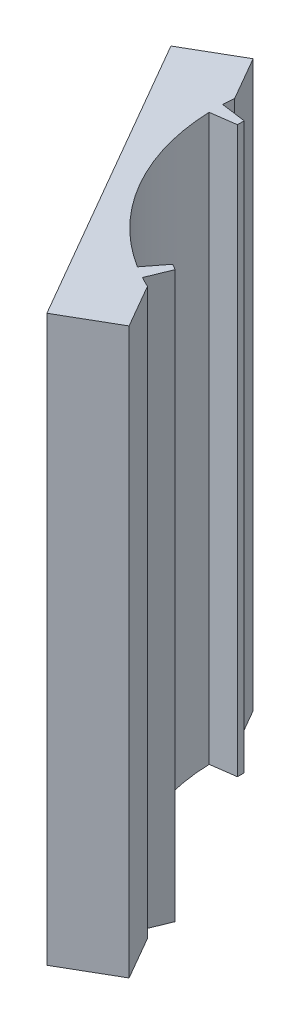
ISO-10303-21;
HEADER;
FILE_DESCRIPTION(('STEP AP214'),'2;1');
FILE_NAME('part.step','',(''),(''),'','','');
FILE_SCHEMA(('AUTOMOTIVE_DESIGN { 1 0 10303 214 1 1 1 1 }'));
ENDSEC;
DATA;
#1=APPLICATION_CONTEXT('core data for automotive mechanical design processes');
#2=APPLICATION_PROTOCOL_DEFINITION('international standard','automotive_design',2000,#1);
#3=PRODUCT_CONTEXT('',#1,'mechanical');
#4=PRODUCT('Part','Part','',(#3));
#5=PRODUCT_RELATED_PRODUCT_CATEGORY('part','',(#4));
#6=PRODUCT_DEFINITION_FORMATION('','',#4);
#7=PRODUCT_DEFINITION_CONTEXT('part definition',#1,'design');
#8=PRODUCT_DEFINITION('design','',#6,#7);
#9=PRODUCT_DEFINITION_SHAPE('','',#8);
#10=(LENGTH_UNIT() NAMED_UNIT(*) SI_UNIT(.MILLI.,.METRE.));
#11=(NAMED_UNIT(*) PLANE_ANGLE_UNIT() SI_UNIT($,.RADIAN.));
#12=(NAMED_UNIT(*) SI_UNIT($,.STERADIAN.) SOLID_ANGLE_UNIT());
#13=UNCERTAINTY_MEASURE_WITH_UNIT(LENGTH_MEASURE(1.E-05),#10,'distance_accuracy_value','');
#14=(GEOMETRIC_REPRESENTATION_CONTEXT(3) GLOBAL_UNCERTAINTY_ASSIGNED_CONTEXT((#13)) GLOBAL_UNIT_ASSIGNED_CONTEXT((#10,
#11,#12)) REPRESENTATION_CONTEXT('',''));
#15=CARTESIAN_POINT('',(0.,0.,0.));
#16=DIRECTION('',(0.,0.,1.));
#17=DIRECTION('',(1.,0.,0.));
#18=AXIS2_PLACEMENT_3D('',#15,#16,#17);
#19=CARTESIAN_POINT('',(7.50000000000003,50.,12.9903810567665));
#20=DIRECTION('',(0.500000000000002,0.,0.866025403784437));
#21=DIRECTION('',(0.866025403784437,0.,-0.500000000000002));
#22=AXIS2_PLACEMENT_3D('',#19,#20,#21);
#23=PLANE('',#22);
#24=DIRECTION('',(-0.866025403784437,0.,0.500000000000002));
#25=VECTOR('',#24,1.);
#26=CARTESIAN_POINT('',(7.50000000000003,0.,12.9903810567665));
#27=LINE('',#26,#25);
#28=CARTESIAN_POINT('',(-5.55299139381477,0.,20.5265291517154));
#29=VERTEX_POINT('',#28);
#30=CARTESIAN_POINT('',(-10.1669182372025,0.,23.1903810567666));
#31=VERTEX_POINT('',#30);
#32=EDGE_CURVE('E166',#29,#31,#27,.T.);
#33=ORIENTED_EDGE('',*,*,#32,.F.);
#34=DIRECTION('',(0.,-1.,0.));
#35=VECTOR('',#34,1.);
#36=CARTESIAN_POINT('',(-5.55299139381477,50.,20.5265291517154));
#37=LINE('',#36,#35);
#38=CARTESIAN_POINT('',(-5.55299139381477,50.,20.5265291517154));
#39=VERTEX_POINT('',#38);
#40=EDGE_CURVE('E11',#39,#29,#37,.T.);
#41=ORIENTED_EDGE('',*,*,#40,.F.);
#42=DIRECTION('',(-0.866025403784437,0.,0.500000000000002));
#43=VECTOR('',#42,1.);
#44=CARTESIAN_POINT('',(7.50000000000003,50.,12.9903810567665));
#45=LINE('',#44,#43);
#46=CARTESIAN_POINT('',(-10.1669182372025,50.,23.1903810567666));
#47=VERTEX_POINT('',#46);
#48=EDGE_CURVE('E198',#39,#47,#45,.T.);
#49=ORIENTED_EDGE('',*,*,#48,.T.);
#50=DIRECTION('',(0.,-1.,0.));
#51=VECTOR('',#50,1.);
#52=CARTESIAN_POINT('',(-10.1669182372025,50.,23.1903810567666));
#53=LINE('',#52,#51);
#54=EDGE_CURVE('E51',#47,#31,#53,.T.);
#55=ORIENTED_EDGE('',*,*,#54,.T.);
#56=EDGE_LOOP('',(#33,#41,#49,#55));
#57=FACE_BOUND('',#56,.T.);
#58=ADVANCED_FACE('F35',(#57),#23,.T.);
#59=CARTESIAN_POINT('',(-13.0529913938148,50.,7.53614809494887));
#60=DIRECTION('',(0.866025403784438,0.,-0.500000000000001));
#61=DIRECTION('',(-0.500000000000001,0.,-0.866025403784438));
#62=AXIS2_PLACEMENT_3D('',#59,#60,#61);
#63=PLANE('',#62);
#64=DIRECTION('',(0.500000000000001,0.,0.866025403784438));
#65=VECTOR('',#64,1.);
#66=CARTESIAN_POINT('',(-13.0529913938148,0.,7.53614809494887));
#67=LINE('',#66,#65);
#68=CARTESIAN_POINT('',(-7.77601575515593,0.,16.6761380114092));
#69=VERTEX_POINT('',#68);
#70=EDGE_CURVE('E168',#69,#29,#67,.T.);
#71=ORIENTED_EDGE('',*,*,#70,.F.);
#72=DIRECTION('',(0.,-1.,0.));
#73=VECTOR('',#72,1.);
#74=CARTESIAN_POINT('',(-7.77601575515593,50.,16.6761380114092));
#75=LINE('',#74,#73);
#76=CARTESIAN_POINT('',(-7.77601575515593,50.,16.6761380114092));
#77=VERTEX_POINT('',#76);
#78=EDGE_CURVE('E43',#77,#69,#75,.T.);
#79=ORIENTED_EDGE('',*,*,#78,.F.);
#80=DIRECTION('',(0.500000000000001,0.,0.866025403784438));
#81=VECTOR('',#80,1.);
#82=CARTESIAN_POINT('',(-13.0529913938148,50.,7.53614809494887));
#83=LINE('',#82,#81);
#84=EDGE_CURVE('E157',#77,#39,#83,.T.);
#85=ORIENTED_EDGE('',*,*,#84,.T.);
#86=ORIENTED_EDGE('',*,*,#40,.T.);
#87=EDGE_LOOP('',(#71,#79,#85,#86));
#88=FACE_BOUND('',#87,.T.);
#89=ADVANCED_FACE('F228',(#88),#63,.T.);
#90=CARTESIAN_POINT('',(0.,50.,0.));
#91=DIRECTION('',(0.,-1.,0.));
#92=DIRECTION('',(0.,0.,-1.));
#93=AXIS2_PLACEMENT_3D('',#90,#91,#92);
#94=CYLINDRICAL_SURFACE('',#93,18.4);
#95=CARTESIAN_POINT('',(0.,0.,0.));
#96=DIRECTION('',(0.,1.,0.));
#97=DIRECTION('',(0.,0.,1.));
#98=AXIS2_PLACEMENT_3D('',#95,#96,#97);
#99=CIRCLE('',#98,18.4);
#100=CARTESIAN_POINT('',(-8.67549215242567,0.,16.2263931886664));
#101=VERTEX_POINT('',#100);
#102=EDGE_CURVE('E171',#101,#69,#99,.T.);
#103=ORIENTED_EDGE('',*,*,#102,.F.);
#104=DIRECTION('',(0.,-1.,0.));
#105=VECTOR('',#104,1.);
#106=CARTESIAN_POINT('',(-8.67549215242567,50.,16.2263931886664));
#107=LINE('',#106,#105);
#108=CARTESIAN_POINT('',(-8.67549215242567,50.,16.2263931886664));
#109=VERTEX_POINT('',#108);
#110=EDGE_CURVE('E217',#109,#101,#107,.T.);
#111=ORIENTED_EDGE('',*,*,#110,.F.);
#112=CARTESIAN_POINT('',(0.,50.,0.));
#113=DIRECTION('',(0.,1.,0.));
#114=DIRECTION('',(0.,0.,1.));
#115=AXIS2_PLACEMENT_3D('',#112,#113,#114);
#116=CIRCLE('',#115,18.4);
#117=EDGE_CURVE('E224',#109,#77,#116,.T.);
#118=ORIENTED_EDGE('',*,*,#117,.T.);
#119=ORIENTED_EDGE('',*,*,#78,.T.);
#120=EDGE_LOOP('',(#103,#111,#118,#119));
#121=FACE_BOUND('',#120,.T.);
#122=ADVANCED_FACE('F222',(#121),#94,.F.);
#123=CARTESIAN_POINT('',(-1.74759815570033,50.,-0.714664627382081));
#124=DIRECTION('',(0.925595557587385,0.,0.378514020578496));
#125=DIRECTION('',(0.378514020578496,0.,-0.925595557587385));
#126=AXIS2_PLACEMENT_3D('',#123,#124,#125);
#127=PLANE('',#126);
#128=DIRECTION('',(-0.378514020578496,0.,0.925595557587385));
#129=VECTOR('',#128,1.);
#130=CARTESIAN_POINT('',(-1.74759815570033,0.,-0.714664627382081));
#131=LINE('',#130,#129);
#132=CARTESIAN_POINT('',(-7.83431886252672,0.,14.1694383125916));
#133=VERTEX_POINT('',#132);
#134=EDGE_CURVE('E174',#133,#101,#131,.T.);
#135=ORIENTED_EDGE('',*,*,#134,.F.);
#136=DIRECTION('',(0.,-1.,0.));
#137=VECTOR('',#136,1.);
#138=CARTESIAN_POINT('',(-7.83431886252672,50.,14.1694383125916));
#139=LINE('',#138,#137);
#140=CARTESIAN_POINT('',(-7.83431886252672,50.,14.1694383125916));
#141=VERTEX_POINT('',#140);
#142=EDGE_CURVE('E215',#141,#133,#139,.T.);
#143=ORIENTED_EDGE('',*,*,#142,.F.);
#144=DIRECTION('',(-0.378514020578496,0.,0.925595557587385));
#145=VECTOR('',#144,1.);
#146=CARTESIAN_POINT('',(-1.74759815570033,50.,-0.714664627382081));
#147=LINE('',#146,#145);
#148=EDGE_CURVE('E239',#141,#109,#147,.T.);
#149=ORIENTED_EDGE('',*,*,#148,.T.);
#150=ORIENTED_EDGE('',*,*,#110,.T.);
#151=EDGE_LOOP('',(#135,#143,#149,#150));
#152=FACE_BOUND('',#151,.T.);
#153=ADVANCED_FACE('F235',(#152),#127,.T.);
#154=CARTESIAN_POINT('',(-8.09412648366208,50.,14.0194383125916));
#155=DIRECTION('',(-0.499999999999999,0.,0.866025403784439));
#156=DIRECTION('',(0.866025403784439,0.,0.499999999999999));
#157=AXIS2_PLACEMENT_3D('',#154,#155,#156);
#158=PLANE('',#157);
#159=DIRECTION('',(-0.866025403784439,0.,-0.499999999999999));
#160=VECTOR('',#159,1.);
#161=CARTESIAN_POINT('',(-8.09412648366208,0.,14.0194383125916));
#162=LINE('',#161,#160);
#163=CARTESIAN_POINT('',(-8.35393410479738,0.,13.8694383125916));
#164=VERTEX_POINT('',#163);
#165=EDGE_CURVE('E179',#133,#164,#162,.T.);
#166=ORIENTED_EDGE('',*,*,#165,.T.);
#167=DIRECTION('',(0.,-1.,0.));
#168=VECTOR('',#167,1.);
#169=CARTESIAN_POINT('',(-8.35393410479738,50.,13.8694383125916));
#170=LINE('',#169,#168);
#171=CARTESIAN_POINT('',(-8.35393410479738,50.,13.8694383125916));
#172=VERTEX_POINT('',#171);
#173=EDGE_CURVE('E212',#172,#164,#170,.T.);
#174=ORIENTED_EDGE('',*,*,#173,.F.);
#175=DIRECTION('',(-0.866025403784439,0.,-0.499999999999999));
#176=VECTOR('',#175,1.);
#177=CARTESIAN_POINT('',(-8.09412648366208,50.,14.0194383125916));
#178=LINE('',#177,#176);
#179=EDGE_CURVE('E242',#141,#172,#178,.T.);
#180=ORIENTED_EDGE('',*,*,#179,.F.);
#181=ORIENTED_EDGE('',*,*,#142,.T.);
#182=EDGE_LOOP('',(#166,#174,#180,#181));
#183=FACE_BOUND('',#182,.T.);
#184=ADVANCED_FACE('F307',(#183),#158,.F.);
#185=CARTESIAN_POINT('',(1.49271680034924,50.,1.15613208475232));
#186=DIRECTION('',(0.790600536303257,0.,0.612332256211448));
#187=DIRECTION('',(0.612332256211448,0.,-0.790600536303257));
#188=AXIS2_PLACEMENT_3D('',#185,#186,#187);
#189=PLANE('',#188);
#190=DIRECTION('',(-0.612332256211448,0.,0.790600536303257));
#191=VECTOR('',#190,1.);
#192=CARTESIAN_POINT('',(1.49271680034924,0.,1.15613208475232));
#193=LINE('',#192,#191);
#194=CARTESIAN_POINT('',(-9.71472263696699,0.,15.6263931886664));
#195=VERTEX_POINT('',#194);
#196=EDGE_CURVE('E181',#164,#195,#193,.T.);
#197=ORIENTED_EDGE('',*,*,#196,.T.);
#198=DIRECTION('',(0.,-1.,0.));
#199=VECTOR('',#198,1.);
#200=CARTESIAN_POINT('',(-9.71472263696699,50.,15.6263931886664));
#201=LINE('',#200,#199);
#202=CARTESIAN_POINT('',(-9.71472263696699,50.,15.6263931886664));
#203=VERTEX_POINT('',#202);
#204=EDGE_CURVE('E210',#203,#195,#201,.T.);
#205=ORIENTED_EDGE('',*,*,#204,.F.);
#206=DIRECTION('',(-0.612332256211448,0.,0.790600536303257));
#207=VECTOR('',#206,1.);
#208=CARTESIAN_POINT('',(1.49271680034924,50.,1.15613208475232));
#209=LINE('',#208,#207);
#210=EDGE_CURVE('E246',#172,#203,#209,.T.);
#211=ORIENTED_EDGE('',*,*,#210,.F.);
#212=ORIENTED_EDGE('',*,*,#173,.T.);
#213=EDGE_LOOP('',(#197,#205,#211,#212));
#214=FACE_BOUND('',#213,.T.);
#215=ADVANCED_FACE('F300',(#214),#189,.F.);
#216=CARTESIAN_POINT('',(-18.3902147893928,0.,0.6));
#217=VERTEX_POINT('',#216);
#218=EDGE_CURVE('E176',#217,#195,#99,.T.);
#219=ORIENTED_EDGE('',*,*,#218,.F.);
#220=DIRECTION('',(0.,-1.,0.));
#221=VECTOR('',#220,1.);
#222=CARTESIAN_POINT('',(-18.3902147893928,50.,0.6));
#223=LINE('',#222,#221);
#224=CARTESIAN_POINT('',(-18.3902147893928,50.,0.6));
#225=VERTEX_POINT('',#224);
#226=EDGE_CURVE('E208',#225,#217,#223,.T.);
#227=ORIENTED_EDGE('',*,*,#226,.F.);
#228=EDGE_CURVE('E241',#225,#203,#116,.T.);
#229=ORIENTED_EDGE('',*,*,#228,.T.);
#230=ORIENTED_EDGE('',*,*,#204,.T.);
#231=EDGE_LOOP('',(#219,#227,#229,#230));
#232=FACE_BOUND('',#231,.T.);
#233=ADVANCED_FACE('F288',(#232),#94,.F.);
#234=CARTESIAN_POINT('',(-0.254881355351149,50.,-1.8707967121344));
#235=DIRECTION('',(0.134995021284128,0.,0.990846276789946));
#236=DIRECTION('',(0.990846276789946,0.,-0.134995021284128));
#237=AXIS2_PLACEMENT_3D('',#234,#235,#236);
#238=PLANE('',#237);
#239=DIRECTION('',(-0.990846276789946,0.,0.134995021284128));
#240=VECTOR('',#239,1.);
#241=CARTESIAN_POINT('',(-0.254881355351149,0.,-1.8707967121344));
#242=LINE('',#241,#240);
#243=CARTESIAN_POINT('',(-16.1882529673242,0.,0.3));
#244=VERTEX_POINT('',#243);
#245=EDGE_CURVE('E184',#244,#217,#242,.T.);
#246=ORIENTED_EDGE('',*,*,#245,.F.);
#247=DIRECTION('',(0.,-1.,0.));
#248=VECTOR('',#247,1.);
#249=CARTESIAN_POINT('',(-16.1882529673242,50.,0.3));
#250=LINE('',#249,#248);
#251=CARTESIAN_POINT('',(-16.1882529673242,50.,0.3));
#252=VERTEX_POINT('',#251);
#253=EDGE_CURVE('E206',#252,#244,#250,.T.);
#254=ORIENTED_EDGE('',*,*,#253,.F.);
#255=DIRECTION('',(-0.990846276789946,0.,0.134995021284128));
#256=VECTOR('',#255,1.);
#257=CARTESIAN_POINT('',(-0.254881355351149,50.,-1.8707967121344));
#258=LINE('',#257,#256);
#259=EDGE_CURVE('E245',#252,#225,#258,.T.);
#260=ORIENTED_EDGE('',*,*,#259,.T.);
#261=ORIENTED_EDGE('',*,*,#226,.T.);
#262=EDGE_LOOP('',(#246,#254,#260,#261));
#263=FACE_BOUND('',#262,.T.);
#264=ADVANCED_FACE('F299',(#263),#238,.T.);
#265=CARTESIAN_POINT('',(-16.1882529673242,50.,0.));
#266=DIRECTION('',(1.,0.,0.));
#267=DIRECTION('',(0.,0.,-1.));
#268=AXIS2_PLACEMENT_3D('',#265,#266,#267);
#269=PLANE('',#268);
#270=DIRECTION('',(0.,0.,1.));
#271=VECTOR('',#270,1.);
#272=CARTESIAN_POINT('',(-16.1882529673242,0.,0.));
#273=LINE('',#272,#271);
#274=CARTESIAN_POINT('',(-16.1882529673242,0.,-0.3));
#275=VERTEX_POINT('',#274);
#276=EDGE_CURVE('E187',#275,#244,#273,.T.);
#277=ORIENTED_EDGE('',*,*,#276,.F.);
#278=DIRECTION('',(0.,-1.,0.));
#279=VECTOR('',#278,1.);
#280=CARTESIAN_POINT('',(-16.1882529673242,50.,-0.3));
#281=LINE('',#280,#279);
#282=CARTESIAN_POINT('',(-16.1882529673242,50.,-0.3));
#283=VERTEX_POINT('',#282);
#284=EDGE_CURVE('E204',#283,#275,#281,.T.);
#285=ORIENTED_EDGE('',*,*,#284,.F.);
#286=DIRECTION('',(0.,0.,1.));
#287=VECTOR('',#286,1.);
#288=CARTESIAN_POINT('',(-16.1882529673242,50.,0.));
#289=LINE('',#288,#287);
#290=EDGE_CURVE('E250',#283,#252,#289,.T.);
#291=ORIENTED_EDGE('',*,*,#290,.T.);
#292=ORIENTED_EDGE('',*,*,#253,.T.);
#293=EDGE_LOOP('',(#277,#285,#291,#292));
#294=FACE_BOUND('',#293,.T.);
#295=ADVANCED_FACE('F296',(#294),#269,.T.);
#296=CARTESIAN_POINT('',(-0.254881355351148,50.,1.8707967121344));
#297=DIRECTION('',(-0.134995021284128,0.,0.990846276789946));
#298=DIRECTION('',(0.990846276789946,0.,0.134995021284128));
#299=AXIS2_PLACEMENT_3D('',#296,#297,#298);
#300=PLANE('',#299);
#301=DIRECTION('',(-0.990846276789946,0.,-0.134995021284128));
#302=VECTOR('',#301,1.);
#303=CARTESIAN_POINT('',(-0.254881355351148,0.,1.8707967121344));
#304=LINE('',#303,#302);
#305=CARTESIAN_POINT('',(-18.3902147893928,0.,-0.6));
#306=VERTEX_POINT('',#305);
#307=EDGE_CURVE('E190',#275,#306,#304,.T.);
#308=ORIENTED_EDGE('',*,*,#307,.T.);
#309=DIRECTION('',(0.,-1.,0.));
#310=VECTOR('',#309,1.);
#311=CARTESIAN_POINT('',(-18.3902147893928,50.,-0.6));
#312=LINE('',#311,#310);
#313=CARTESIAN_POINT('',(-18.3902147893928,50.,-0.6));
#314=VERTEX_POINT('',#313);
#315=EDGE_CURVE('E202',#314,#306,#312,.T.);
#316=ORIENTED_EDGE('',*,*,#315,.F.);
#317=DIRECTION('',(-0.990846276789946,0.,-0.134995021284128));
#318=VECTOR('',#317,1.);
#319=CARTESIAN_POINT('',(-0.254881355351148,50.,1.8707967121344));
#320=LINE('',#319,#318);
#321=EDGE_CURVE('E163',#283,#314,#320,.T.);
#322=ORIENTED_EDGE('',*,*,#321,.F.);
#323=ORIENTED_EDGE('',*,*,#284,.T.);
#324=EDGE_LOOP('',(#308,#316,#322,#323));
#325=FACE_BOUND('',#324,.T.);
#326=ADVANCED_FACE('F263',(#325),#300,.F.);
#327=CARTESIAN_POINT('',(-18.3299670324736,0.,-1.60384182151147));
#328=VERTEX_POINT('',#327);
#329=EDGE_CURVE('E175',#328,#306,#99,.T.);
#330=ORIENTED_EDGE('',*,*,#329,.F.);
#331=DIRECTION('',(0.,-1.,0.));
#332=VECTOR('',#331,1.);
#333=CARTESIAN_POINT('',(-18.3299670324736,50.,-1.60384182151147));
#334=LINE('',#333,#332);
#335=CARTESIAN_POINT('',(-18.3299670324736,50.,-1.60384182151147));
#336=VERTEX_POINT('',#335);
#337=EDGE_CURVE('E146',#336,#328,#334,.T.);
#338=ORIENTED_EDGE('',*,*,#337,.F.);
#339=EDGE_CURVE('E155',#336,#314,#116,.T.);
#340=ORIENTED_EDGE('',*,*,#339,.T.);
#341=ORIENTED_EDGE('',*,*,#315,.T.);
#342=EDGE_LOOP('',(#330,#338,#340,#341));
#343=FACE_BOUND('',#342,.T.);
#344=ADVANCED_FACE('F268',(#343),#94,.F.);
#345=CARTESIAN_POINT('',(-20.5529913938148,0.,-5.4542329618177));
#346=VERTEX_POINT('',#345);
#347=EDGE_CURVE('E142',#346,#328,#67,.T.);
#348=ORIENTED_EDGE('',*,*,#347,.F.);
#349=DIRECTION('',(0.,-1.,0.));
#350=VECTOR('',#349,1.);
#351=CARTESIAN_POINT('',(-20.5529913938148,50.,-5.4542329618177));
#352=LINE('',#351,#350);
#353=CARTESIAN_POINT('',(-20.5529913938148,50.,-5.4542329618177));
#354=VERTEX_POINT('',#353);
#355=EDGE_CURVE('E137',#354,#346,#352,.T.);
#356=ORIENTED_EDGE('',*,*,#355,.F.);
#357=EDGE_CURVE('E140',#354,#336,#83,.T.);
#358=ORIENTED_EDGE('',*,*,#357,.T.);
#359=ORIENTED_EDGE('',*,*,#337,.T.);
#360=EDGE_LOOP('',(#348,#356,#358,#359));
#361=FACE_BOUND('',#360,.T.);
#362=ADVANCED_FACE('F139',(#361),#63,.T.);
#363=CARTESIAN_POINT('',(-7.50000000000001,50.,-12.9903810567666));
#364=DIRECTION('',(-0.500000000000001,0.,-0.866025403784438));
#365=DIRECTION('',(-0.866025403784438,0.,0.500000000000001));
#366=AXIS2_PLACEMENT_3D('',#363,#364,#365);
#367=PLANE('',#366);
#368=DIRECTION('',(0.866025403784438,0.,-0.500000000000001));
#369=VECTOR('',#368,1.);
#370=CARTESIAN_POINT('',(-7.50000000000001,0.,-12.9903810567666));
#371=LINE('',#370,#369);
#372=CARTESIAN_POINT('',(-25.1669182372026,0.,-2.79038105676654));
#373=VERTEX_POINT('',#372);
#374=EDGE_CURVE('E193',#373,#346,#371,.T.);
#375=ORIENTED_EDGE('',*,*,#374,.F.);
#376=DIRECTION('',(0.,-1.,0.));
#377=VECTOR('',#376,1.);
#378=CARTESIAN_POINT('',(-25.1669182372026,50.,-2.79038105676654));
#379=LINE('',#378,#377);
#380=CARTESIAN_POINT('',(-25.1669182372026,50.,-2.79038105676654));
#381=VERTEX_POINT('',#380);
#382=EDGE_CURVE('E94',#381,#373,#379,.T.);
#383=ORIENTED_EDGE('',*,*,#382,.F.);
#384=DIRECTION('',(0.866025403784438,0.,-0.500000000000001));
#385=VECTOR('',#384,1.);
#386=CARTESIAN_POINT('',(-7.50000000000001,50.,-12.9903810567666));
#387=LINE('',#386,#385);
#388=EDGE_CURVE('E153',#381,#354,#387,.T.);
#389=ORIENTED_EDGE('',*,*,#388,.T.);
#390=ORIENTED_EDGE('',*,*,#355,.T.);
#391=EDGE_LOOP('',(#375,#383,#389,#390));
#392=FACE_BOUND('',#391,.T.);
#393=ADVANCED_FACE('F158',(#392),#367,.T.);
#394=CARTESIAN_POINT('',(-17.6669182372025,50.,10.2));
#395=DIRECTION('',(-0.866025403784438,0.,0.500000000000001));
#396=DIRECTION('',(0.500000000000001,0.,0.866025403784438));
#397=AXIS2_PLACEMENT_3D('',#394,#395,#396);
#398=PLANE('',#397);
#399=DIRECTION('',(-0.500000000000001,0.,-0.866025403784438));
#400=VECTOR('',#399,1.);
#401=CARTESIAN_POINT('',(-17.6669182372025,0.,10.2));
#402=LINE('',#401,#400);
#403=EDGE_CURVE('E195',#31,#373,#402,.T.);
#404=ORIENTED_EDGE('',*,*,#403,.F.);
#405=ORIENTED_EDGE('',*,*,#54,.F.);
#406=DIRECTION('',(-0.500000000000001,0.,-0.866025403784438));
#407=VECTOR('',#406,1.);
#408=CARTESIAN_POINT('',(-17.6669182372025,50.,10.2));
#409=LINE('',#408,#407);
#410=EDGE_CURVE('E159',#47,#381,#409,.T.);
#411=ORIENTED_EDGE('',*,*,#410,.T.);
#412=ORIENTED_EDGE('',*,*,#382,.T.);
#413=EDGE_LOOP('',(#404,#405,#411,#412));
#414=FACE_BOUND('',#413,.T.);
#415=ADVANCED_FACE('F269',(#414),#398,.T.);
#416=CARTESIAN_POINT('',(0.,50.,0.));
#417=DIRECTION('',(0.,1.,0.));
#418=DIRECTION('',(0.,0.,1.));
#419=AXIS2_PLACEMENT_3D('',#416,#417,#418);
#420=PLANE('',#419);
#421=ORIENTED_EDGE('',*,*,#48,.F.);
#422=ORIENTED_EDGE('',*,*,#84,.F.);
#423=ORIENTED_EDGE('',*,*,#117,.F.);
#424=ORIENTED_EDGE('',*,*,#148,.F.);
#425=ORIENTED_EDGE('',*,*,#179,.T.);
#426=ORIENTED_EDGE('',*,*,#210,.T.);
#427=ORIENTED_EDGE('',*,*,#228,.F.);
#428=ORIENTED_EDGE('',*,*,#259,.F.);
#429=ORIENTED_EDGE('',*,*,#290,.F.);
#430=ORIENTED_EDGE('',*,*,#321,.T.);
#431=ORIENTED_EDGE('',*,*,#339,.F.);
#432=ORIENTED_EDGE('',*,*,#357,.F.);
#433=ORIENTED_EDGE('',*,*,#388,.F.);
#434=ORIENTED_EDGE('',*,*,#410,.F.);
#435=EDGE_LOOP('',(#421,#422,#423,#424,#425,#426,#427,#428,#429,#430,#431,#432,#433,#434));
#436=FACE_BOUND('',#435,.T.);
#437=ADVANCED_FACE('F151',(#436),#420,.T.);
#438=CARTESIAN_POINT('',(0.,0.,0.));
#439=DIRECTION('',(0.,1.,0.));
#440=DIRECTION('',(0.,0.,1.));
#441=AXIS2_PLACEMENT_3D('',#438,#439,#440);
#442=PLANE('',#441);
#443=ORIENTED_EDGE('',*,*,#32,.T.);
#444=ORIENTED_EDGE('',*,*,#403,.T.);
#445=ORIENTED_EDGE('',*,*,#374,.T.);
#446=ORIENTED_EDGE('',*,*,#347,.T.);
#447=ORIENTED_EDGE('',*,*,#329,.T.);
#448=ORIENTED_EDGE('',*,*,#307,.F.);
#449=ORIENTED_EDGE('',*,*,#276,.T.);
#450=ORIENTED_EDGE('',*,*,#245,.T.);
#451=ORIENTED_EDGE('',*,*,#218,.T.);
#452=ORIENTED_EDGE('',*,*,#196,.F.);
#453=ORIENTED_EDGE('',*,*,#165,.F.);
#454=ORIENTED_EDGE('',*,*,#134,.T.);
#455=ORIENTED_EDGE('',*,*,#102,.T.);
#456=ORIENTED_EDGE('',*,*,#70,.T.);
#457=EDGE_LOOP('',(#443,#444,#445,#446,#447,#448,#449,#450,#451,#452,#453,#454,#455,#456));
#458=FACE_BOUND('',#457,.T.);
#459=ADVANCED_FACE('F230',(#458),#442,.F.);
#460=CLOSED_SHELL('',(#58,#89,#122,#153,#184,#215,#233,#264,#295,#326,#344,#362,#393,#415,#437,#459));
#461=MANIFOLD_SOLID_BREP('B2',#460);
#462=ADVANCED_BREP_SHAPE_REPRESENTATION('',(#18,#461),#14);
#463=SHAPE_DEFINITION_REPRESENTATION(#9,#462);
ENDSEC;
END-ISO-10303-21;
